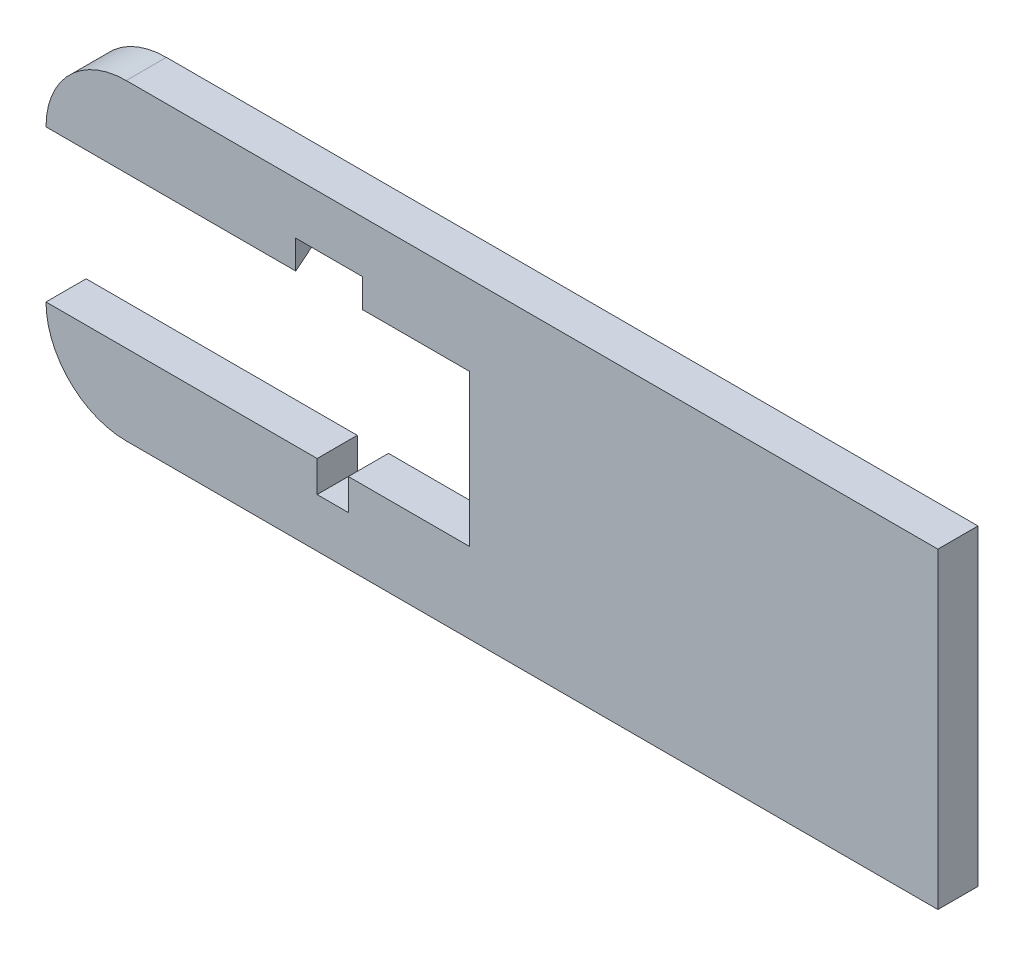
ISO-10303-21;
HEADER;
FILE_DESCRIPTION(('STEP AP214'),'2;1');
FILE_NAME('part.step','',(''),(''),'','','');
FILE_SCHEMA(('AUTOMOTIVE_DESIGN { 1 0 10303 214 1 1 1 1 }'));
ENDSEC;
DATA;
#1=APPLICATION_CONTEXT('core data for automotive mechanical design processes');
#2=APPLICATION_PROTOCOL_DEFINITION('international standard','automotive_design',2000,#1);
#3=PRODUCT_CONTEXT('',#1,'mechanical');
#4=PRODUCT('Part','Part','',(#3));
#5=PRODUCT_RELATED_PRODUCT_CATEGORY('part','',(#4));
#6=PRODUCT_DEFINITION_FORMATION('','',#4);
#7=PRODUCT_DEFINITION_CONTEXT('part definition',#1,'design');
#8=PRODUCT_DEFINITION('design','',#6,#7);
#9=PRODUCT_DEFINITION_SHAPE('','',#8);
#10=(LENGTH_UNIT() NAMED_UNIT(*) SI_UNIT(.MILLI.,.METRE.));
#11=(NAMED_UNIT(*) PLANE_ANGLE_UNIT() SI_UNIT($,.RADIAN.));
#12=(NAMED_UNIT(*) SI_UNIT($,.STERADIAN.) SOLID_ANGLE_UNIT());
#13=UNCERTAINTY_MEASURE_WITH_UNIT(LENGTH_MEASURE(1.E-05),#10,'distance_accuracy_value','');
#14=(GEOMETRIC_REPRESENTATION_CONTEXT(3) GLOBAL_UNCERTAINTY_ASSIGNED_CONTEXT((#13)) GLOBAL_UNIT_ASSIGNED_CONTEXT((#10,
#11,#12)) REPRESENTATION_CONTEXT('',''));
#15=CARTESIAN_POINT('',(0.,0.,0.));
#16=DIRECTION('',(0.,0.,1.));
#17=DIRECTION('',(1.,0.,0.));
#18=AXIS2_PLACEMENT_3D('',#15,#16,#17);
#19=CARTESIAN_POINT('',(120.65,66.04,0.));
#20=DIRECTION('',(0.,1.,0.));
#21=DIRECTION('',(0.,0.,1.));
#22=AXIS2_PLACEMENT_3D('',#19,#20,#21);
#23=PLANE('',#22);
#24=DIRECTION('',(-1.,0.,0.));
#25=VECTOR('',#24,1.);
#26=CARTESIAN_POINT('',(120.65,66.04,11.43));
#27=LINE('',#26,#25);
#28=CARTESIAN_POINT('',(120.65,66.04,11.43));
#29=VERTEX_POINT('',#28);
#30=CARTESIAN_POINT('',(90.17,66.04,11.43));
#31=VERTEX_POINT('',#30);
#32=EDGE_CURVE('E223',#29,#31,#27,.T.);
#33=ORIENTED_EDGE('',*,*,#32,.T.);
#34=DIRECTION('',(0.,0.,1.));
#35=VECTOR('',#34,1.);
#36=CARTESIAN_POINT('',(90.17,66.04,-20.7115157340065));
#37=LINE('',#36,#35);
#38=CARTESIAN_POINT('',(90.17,66.04,0.));
#39=VERTEX_POINT('',#38);
#40=EDGE_CURVE('E167',#39,#31,#37,.T.);
#41=ORIENTED_EDGE('',*,*,#40,.F.);
#42=DIRECTION('',(-1.,0.,0.));
#43=VECTOR('',#42,1.);
#44=CARTESIAN_POINT('',(120.65,66.04,0.));
#45=LINE('',#44,#43);
#46=CARTESIAN_POINT('',(120.65,66.04,0.));
#47=VERTEX_POINT('',#46);
#48=EDGE_CURVE('E218',#47,#39,#45,.T.);
#49=ORIENTED_EDGE('',*,*,#48,.F.);
#50=DIRECTION('',(0.,0.,-1.));
#51=VECTOR('',#50,1.);
#52=CARTESIAN_POINT('',(120.65,66.04,0.));
#53=LINE('',#52,#51);
#54=EDGE_CURVE('E56',#29,#47,#53,.T.);
#55=ORIENTED_EDGE('',*,*,#54,.F.);
#56=EDGE_LOOP('',(#33,#41,#49,#55));
#57=FACE_BOUND('',#56,.T.);
#58=ADVANCED_FACE('F33',(#57),#23,.F.);
#59=CARTESIAN_POINT('',(120.65,22.86,0.));
#60=DIRECTION('',(0.,-1.,0.));
#61=DIRECTION('',(0.,0.,-1.));
#62=AXIS2_PLACEMENT_3D('',#59,#60,#61);
#63=PLANE('',#62);
#64=DIRECTION('',(-1.,0.,0.));
#65=VECTOR('',#64,1.);
#66=CARTESIAN_POINT('',(120.65,22.86,0.));
#67=LINE('',#66,#65);
#68=CARTESIAN_POINT('',(120.65,22.86,0.));
#69=VERTEX_POINT('',#68);
#70=CARTESIAN_POINT('',(86.106,22.86,0.));
#71=VERTEX_POINT('',#70);
#72=EDGE_CURVE('E230',#69,#71,#67,.T.);
#73=ORIENTED_EDGE('',*,*,#72,.T.);
#74=DIRECTION('',(0.,0.,1.));
#75=VECTOR('',#74,1.);
#76=CARTESIAN_POINT('',(86.106,22.86,-12.5723585694968));
#77=LINE('',#76,#75);
#78=CARTESIAN_POINT('',(86.106,22.86,11.43));
#79=VERTEX_POINT('',#78);
#80=EDGE_CURVE('E203',#71,#79,#77,.T.);
#81=ORIENTED_EDGE('',*,*,#80,.T.);
#82=DIRECTION('',(-1.,0.,0.));
#83=VECTOR('',#82,1.);
#84=CARTESIAN_POINT('',(120.65,22.86,11.43));
#85=LINE('',#84,#83);
#86=CARTESIAN_POINT('',(120.65,22.86,11.43));
#87=VERTEX_POINT('',#86);
#88=EDGE_CURVE('E226',#87,#79,#85,.T.);
#89=ORIENTED_EDGE('',*,*,#88,.F.);
#90=DIRECTION('',(0.,0.,1.));
#91=VECTOR('',#90,1.);
#92=CARTESIAN_POINT('',(120.65,22.86,0.));
#93=LINE('',#92,#91);
#94=EDGE_CURVE('E211',#69,#87,#93,.T.);
#95=ORIENTED_EDGE('',*,*,#94,.F.);
#96=EDGE_LOOP('',(#73,#81,#89,#95));
#97=FACE_BOUND('',#96,.T.);
#98=ADVANCED_FACE('F310',(#97),#63,.F.);
#99=CARTESIAN_POINT('',(22.86,22.86,11.43));
#100=DIRECTION('',(0.,0.,-1.));
#101=DIRECTION('',(-1.,0.,0.));
#102=AXIS2_PLACEMENT_3D('',#99,#100,#101);
#103=CYLINDRICAL_SURFACE('',#102,22.86);
#104=DIRECTION('',(0.,0.,-1.));
#105=VECTOR('',#104,1.);
#106=CARTESIAN_POINT('',(22.86,0.,11.43));
#107=LINE('',#106,#105);
#108=CARTESIAN_POINT('',(22.86,0.,11.43));
#109=VERTEX_POINT('',#108);
#110=CARTESIAN_POINT('',(22.86,0.,0.));
#111=VERTEX_POINT('',#110);
#112=EDGE_CURVE('E262',#109,#111,#107,.T.);
#113=ORIENTED_EDGE('',*,*,#112,.F.);
#114=CARTESIAN_POINT('',(22.86,22.86,11.43));
#115=DIRECTION('',(0.,0.,-1.));
#116=DIRECTION('',(-1.,0.,0.));
#117=AXIS2_PLACEMENT_3D('',#114,#115,#116);
#118=CIRCLE('',#117,22.86);
#119=CARTESIAN_POINT('',(0.,22.86,11.43));
#120=VERTEX_POINT('',#119);
#121=EDGE_CURVE('E41',#120,#109,#118,.F.);
#122=ORIENTED_EDGE('',*,*,#121,.F.);
#123=DIRECTION('',(0.,0.,-1.));
#124=VECTOR('',#123,1.);
#125=CARTESIAN_POINT('',(0.,22.86,11.43));
#126=LINE('',#125,#124);
#127=CARTESIAN_POINT('',(0.,22.86,0.));
#128=VERTEX_POINT('',#127);
#129=EDGE_CURVE('E265',#128,#120,#126,.F.);
#130=ORIENTED_EDGE('',*,*,#129,.F.);
#131=CARTESIAN_POINT('',(22.86,22.86,0.));
#132=DIRECTION('',(0.,0.,-1.));
#133=DIRECTION('',(-1.,0.,0.));
#134=AXIS2_PLACEMENT_3D('',#131,#132,#133);
#135=CIRCLE('',#134,22.86);
#136=EDGE_CURVE('E11',#111,#128,#135,.T.);
#137=ORIENTED_EDGE('',*,*,#136,.F.);
#138=EDGE_LOOP('',(#113,#122,#130,#137));
#139=FACE_BOUND('',#138,.T.);
#140=ADVANCED_FACE('F35',(#139),#103,.T.);
#141=CARTESIAN_POINT('',(22.86,66.04,11.43));
#142=DIRECTION('',(0.,0.,-1.));
#143=DIRECTION('',(-1.,0.,0.));
#144=AXIS2_PLACEMENT_3D('',#141,#142,#143);
#145=CYLINDRICAL_SURFACE('',#144,22.86);
#146=DIRECTION('',(0.,0.,-1.));
#147=VECTOR('',#146,1.);
#148=CARTESIAN_POINT('',(0.,66.04,11.43));
#149=LINE('',#148,#147);
#150=CARTESIAN_POINT('',(0.,66.04,11.43));
#151=VERTEX_POINT('',#150);
#152=CARTESIAN_POINT('',(0.,66.04,0.));
#153=VERTEX_POINT('',#152);
#154=EDGE_CURVE('E252',#151,#153,#149,.T.);
#155=ORIENTED_EDGE('',*,*,#154,.F.);
#156=CARTESIAN_POINT('',(22.86,66.04,11.43));
#157=DIRECTION('',(0.,0.,-1.));
#158=DIRECTION('',(-1.,0.,0.));
#159=AXIS2_PLACEMENT_3D('',#156,#157,#158);
#160=CIRCLE('',#159,22.86);
#161=CARTESIAN_POINT('',(22.86,88.9,11.43));
#162=VERTEX_POINT('',#161);
#163=EDGE_CURVE('E258',#162,#151,#160,.F.);
#164=ORIENTED_EDGE('',*,*,#163,.F.);
#165=DIRECTION('',(0.,0.,-1.));
#166=VECTOR('',#165,1.);
#167=CARTESIAN_POINT('',(22.86,88.9,11.43));
#168=LINE('',#167,#166);
#169=CARTESIAN_POINT('',(22.86,88.9,0.));
#170=VERTEX_POINT('',#169);
#171=EDGE_CURVE('E255',#170,#162,#168,.F.);
#172=ORIENTED_EDGE('',*,*,#171,.F.);
#173=CARTESIAN_POINT('',(22.86,66.04,0.));
#174=DIRECTION('',(0.,0.,-1.));
#175=DIRECTION('',(-1.,0.,0.));
#176=AXIS2_PLACEMENT_3D('',#173,#174,#175);
#177=CIRCLE('',#176,22.86);
#178=EDGE_CURVE('E260',#153,#170,#177,.T.);
#179=ORIENTED_EDGE('',*,*,#178,.F.);
#180=EDGE_LOOP('',(#155,#164,#172,#179));
#181=FACE_BOUND('',#180,.T.);
#182=ADVANCED_FACE('F291',(#181),#145,.T.);
#183=CARTESIAN_POINT('',(0.,0.,11.43));
#184=DIRECTION('',(0.,1.,0.));
#185=DIRECTION('',(0.,0.,1.));
#186=AXIS2_PLACEMENT_3D('',#183,#184,#185);
#187=PLANE('',#186);
#188=DIRECTION('',(1.,0.,0.));
#189=VECTOR('',#188,1.);
#190=CARTESIAN_POINT('',(0.,0.,11.43));
#191=LINE('',#190,#189);
#192=CARTESIAN_POINT('',(254.,0.,11.43));
#193=VERTEX_POINT('',#192);
#194=EDGE_CURVE('E233',#109,#193,#191,.T.);
#195=ORIENTED_EDGE('',*,*,#194,.F.);
#196=ORIENTED_EDGE('',*,*,#112,.T.);
#197=DIRECTION('',(1.,0.,0.));
#198=VECTOR('',#197,1.);
#199=CARTESIAN_POINT('',(0.,0.,0.));
#200=LINE('',#199,#198);
#201=CARTESIAN_POINT('',(254.,0.,0.));
#202=VERTEX_POINT('',#201);
#203=EDGE_CURVE('E221',#111,#202,#200,.T.);
#204=ORIENTED_EDGE('',*,*,#203,.T.);
#205=DIRECTION('',(0.,0.,-1.));
#206=VECTOR('',#205,1.);
#207=CARTESIAN_POINT('',(254.,0.,11.43));
#208=LINE('',#207,#206);
#209=EDGE_CURVE('E249',#193,#202,#208,.T.);
#210=ORIENTED_EDGE('',*,*,#209,.F.);
#211=EDGE_LOOP('',(#195,#196,#204,#210));
#212=FACE_BOUND('',#211,.T.);
#213=ADVANCED_FACE('F277',(#212),#187,.F.);
#214=CARTESIAN_POINT('',(254.,0.,11.43));
#215=DIRECTION('',(-1.,0.,0.));
#216=DIRECTION('',(0.,0.,1.));
#217=AXIS2_PLACEMENT_3D('',#214,#215,#216);
#218=PLANE('',#217);
#219=DIRECTION('',(0.,1.,0.));
#220=VECTOR('',#219,1.);
#221=CARTESIAN_POINT('',(254.,0.,0.));
#222=LINE('',#221,#220);
#223=CARTESIAN_POINT('',(254.,88.9,0.));
#224=VERTEX_POINT('',#223);
#225=EDGE_CURVE('E243',#202,#224,#222,.T.);
#226=ORIENTED_EDGE('',*,*,#225,.T.);
#227=DIRECTION('',(0.,0.,-1.));
#228=VECTOR('',#227,1.);
#229=CARTESIAN_POINT('',(254.,88.9,11.43));
#230=LINE('',#229,#228);
#231=CARTESIAN_POINT('',(254.,88.9,11.43));
#232=VERTEX_POINT('',#231);
#233=EDGE_CURVE('E241',#232,#224,#230,.T.);
#234=ORIENTED_EDGE('',*,*,#233,.F.);
#235=DIRECTION('',(0.,1.,0.));
#236=VECTOR('',#235,1.);
#237=CARTESIAN_POINT('',(254.,0.,11.43));
#238=LINE('',#237,#236);
#239=EDGE_CURVE('E235',#193,#232,#238,.T.);
#240=ORIENTED_EDGE('',*,*,#239,.F.);
#241=ORIENTED_EDGE('',*,*,#209,.T.);
#242=EDGE_LOOP('',(#226,#234,#240,#241));
#243=FACE_BOUND('',#242,.T.);
#244=ADVANCED_FACE('F282',(#243),#218,.F.);
#245=CARTESIAN_POINT('',(0.,88.9,11.43));
#246=DIRECTION('',(0.,-1.,0.));
#247=DIRECTION('',(0.,0.,-1.));
#248=AXIS2_PLACEMENT_3D('',#245,#246,#247);
#249=PLANE('',#248);
#250=DIRECTION('',(-1.,0.,0.));
#251=VECTOR('',#250,1.);
#252=CARTESIAN_POINT('',(0.,88.9,0.));
#253=LINE('',#252,#251);
#254=EDGE_CURVE('E236',#224,#170,#253,.T.);
#255=ORIENTED_EDGE('',*,*,#254,.T.);
#256=ORIENTED_EDGE('',*,*,#171,.T.);
#257=DIRECTION('',(-1.,0.,0.));
#258=VECTOR('',#257,1.);
#259=CARTESIAN_POINT('',(0.,88.9,11.43));
#260=LINE('',#259,#258);
#261=EDGE_CURVE('E238',#232,#162,#260,.T.);
#262=ORIENTED_EDGE('',*,*,#261,.F.);
#263=ORIENTED_EDGE('',*,*,#233,.T.);
#264=EDGE_LOOP('',(#255,#256,#262,#263));
#265=FACE_BOUND('',#264,.T.);
#266=ADVANCED_FACE('F286',(#265),#249,.F.);
#267=CARTESIAN_POINT('',(0.,0.,11.43));
#268=DIRECTION('',(0.,0.,-1.));
#269=DIRECTION('',(-1.,0.,0.));
#270=AXIS2_PLACEMENT_3D('',#267,#268,#269);
#271=PLANE('',#270);
#272=DIRECTION('',(-1.,0.,0.));
#273=VECTOR('',#272,1.);
#274=CARTESIAN_POINT('',(71.12,74.168,11.43));
#275=LINE('',#274,#273);
#276=CARTESIAN_POINT('',(90.17,74.168,11.43));
#277=VERTEX_POINT('',#276);
#278=CARTESIAN_POINT('',(71.12,74.168,11.43));
#279=VERTEX_POINT('',#278);
#280=EDGE_CURVE('E160',#277,#279,#275,.T.);
#281=ORIENTED_EDGE('',*,*,#280,.F.);
#282=DIRECTION('',(0.,1.,0.));
#283=VECTOR('',#282,1.);
#284=CARTESIAN_POINT('',(90.17,66.04,11.43));
#285=LINE('',#284,#283);
#286=EDGE_CURVE('E168',#31,#277,#285,.T.);
#287=ORIENTED_EDGE('',*,*,#286,.F.);
#288=ORIENTED_EDGE('',*,*,#32,.F.);
#289=DIRECTION('',(0.,1.,0.));
#290=VECTOR('',#289,1.);
#291=CARTESIAN_POINT('',(120.65,22.86,11.43));
#292=LINE('',#291,#290);
#293=EDGE_CURVE('E214',#87,#29,#292,.T.);
#294=ORIENTED_EDGE('',*,*,#293,.F.);
#295=ORIENTED_EDGE('',*,*,#88,.T.);
#296=DIRECTION('',(0.,1.,0.));
#297=VECTOR('',#296,1.);
#298=CARTESIAN_POINT('',(86.106,22.86,11.43));
#299=LINE('',#298,#297);
#300=CARTESIAN_POINT('',(86.106,13.97,11.43));
#301=VERTEX_POINT('',#300);
#302=EDGE_CURVE('E186',#301,#79,#299,.T.);
#303=ORIENTED_EDGE('',*,*,#302,.F.);
#304=DIRECTION('',(1.,0.,0.));
#305=VECTOR('',#304,1.);
#306=CARTESIAN_POINT('',(77.216,13.97,11.43));
#307=LINE('',#306,#305);
#308=CARTESIAN_POINT('',(77.216,13.97,11.43));
#309=VERTEX_POINT('',#308);
#310=EDGE_CURVE('E189',#309,#301,#307,.T.);
#311=ORIENTED_EDGE('',*,*,#310,.F.);
#312=DIRECTION('',(0.,-1.,0.));
#313=VECTOR('',#312,1.);
#314=CARTESIAN_POINT('',(77.216,22.86,11.43));
#315=LINE('',#314,#313);
#316=CARTESIAN_POINT('',(77.216,22.86,11.43));
#317=VERTEX_POINT('',#316);
#318=EDGE_CURVE('E180',#317,#309,#315,.T.);
#319=ORIENTED_EDGE('',*,*,#318,.F.);
#320=EDGE_CURVE('E229',#317,#120,#85,.T.);
#321=ORIENTED_EDGE('',*,*,#320,.T.);
#322=ORIENTED_EDGE('',*,*,#121,.T.);
#323=ORIENTED_EDGE('',*,*,#194,.T.);
#324=ORIENTED_EDGE('',*,*,#239,.T.);
#325=ORIENTED_EDGE('',*,*,#261,.T.);
#326=ORIENTED_EDGE('',*,*,#163,.T.);
#327=CARTESIAN_POINT('',(71.12,66.04,11.43));
#328=VERTEX_POINT('',#327);
#329=EDGE_CURVE('E173',#328,#151,#27,.T.);
#330=ORIENTED_EDGE('',*,*,#329,.F.);
#331=DIRECTION('',(0.,-1.,0.));
#332=VECTOR('',#331,1.);
#333=CARTESIAN_POINT('',(71.12,66.04,11.43));
#334=LINE('',#333,#332);
#335=EDGE_CURVE('E152',#279,#328,#334,.T.);
#336=ORIENTED_EDGE('',*,*,#335,.F.);
#337=EDGE_LOOP('',(#281,#287,#288,#294,#295,#303,#311,#319,#321,#322,#323,#324,#325,#326,#330,#336));
#338=FACE_BOUND('',#337,.T.);
#339=ADVANCED_FACE('F171',(#338),#271,.F.);
#340=CARTESIAN_POINT('',(0.,0.,0.));
#341=DIRECTION('',(0.,0.,-1.));
#342=DIRECTION('',(-1.,0.,0.));
#343=AXIS2_PLACEMENT_3D('',#340,#341,#342);
#344=PLANE('',#343);
#345=DIRECTION('',(0.,-1.,0.));
#346=VECTOR('',#345,1.);
#347=CARTESIAN_POINT('',(66.04,74.168,0.));
#348=LINE('',#347,#346);
#349=CARTESIAN_POINT('',(66.04,74.168,0.));
#350=VERTEX_POINT('',#349);
#351=CARTESIAN_POINT('',(66.04,66.04,0.));
#352=VERTEX_POINT('',#351);
#353=EDGE_CURVE('E155',#350,#352,#348,.T.);
#354=ORIENTED_EDGE('',*,*,#353,.T.);
#355=EDGE_CURVE('E222',#352,#153,#45,.T.);
#356=ORIENTED_EDGE('',*,*,#355,.T.);
#357=ORIENTED_EDGE('',*,*,#178,.T.);
#358=ORIENTED_EDGE('',*,*,#254,.F.);
#359=ORIENTED_EDGE('',*,*,#225,.F.);
#360=ORIENTED_EDGE('',*,*,#203,.F.);
#361=ORIENTED_EDGE('',*,*,#136,.T.);
#362=CARTESIAN_POINT('',(77.216,22.86,0.));
#363=VERTEX_POINT('',#362);
#364=EDGE_CURVE('E217',#363,#128,#67,.T.);
#365=ORIENTED_EDGE('',*,*,#364,.F.);
#366=DIRECTION('',(0.,-1.,0.));
#367=VECTOR('',#366,1.);
#368=CARTESIAN_POINT('',(77.216,22.86,0.));
#369=LINE('',#368,#367);
#370=CARTESIAN_POINT('',(77.216,13.97,0.));
#371=VERTEX_POINT('',#370);
#372=EDGE_CURVE('E48',#363,#371,#369,.T.);
#373=ORIENTED_EDGE('',*,*,#372,.T.);
#374=DIRECTION('',(1.,0.,0.));
#375=VECTOR('',#374,1.);
#376=CARTESIAN_POINT('',(77.216,13.97,0.));
#377=LINE('',#376,#375);
#378=CARTESIAN_POINT('',(86.106,13.97,0.));
#379=VERTEX_POINT('',#378);
#380=EDGE_CURVE('E188',#371,#379,#377,.T.);
#381=ORIENTED_EDGE('',*,*,#380,.T.);
#382=DIRECTION('',(0.,1.,0.));
#383=VECTOR('',#382,1.);
#384=CARTESIAN_POINT('',(86.106,22.86,0.));
#385=LINE('',#384,#383);
#386=EDGE_CURVE('E200',#379,#71,#385,.T.);
#387=ORIENTED_EDGE('',*,*,#386,.T.);
#388=ORIENTED_EDGE('',*,*,#72,.F.);
#389=DIRECTION('',(0.,-1.,0.));
#390=VECTOR('',#389,1.);
#391=CARTESIAN_POINT('',(120.65,22.86,0.));
#392=LINE('',#391,#390);
#393=EDGE_CURVE('E209',#47,#69,#392,.T.);
#394=ORIENTED_EDGE('',*,*,#393,.F.);
#395=ORIENTED_EDGE('',*,*,#48,.T.);
#396=DIRECTION('',(0.,1.,0.));
#397=VECTOR('',#396,1.);
#398=CARTESIAN_POINT('',(90.17,66.04,0.));
#399=LINE('',#398,#397);
#400=CARTESIAN_POINT('',(90.17,74.168,0.));
#401=VERTEX_POINT('',#400);
#402=EDGE_CURVE('E181',#39,#401,#399,.T.);
#403=ORIENTED_EDGE('',*,*,#402,.T.);
#404=DIRECTION('',(-1.,0.,0.));
#405=VECTOR('',#404,1.);
#406=CARTESIAN_POINT('',(71.12,74.168,0.));
#407=LINE('',#406,#405);
#408=EDGE_CURVE('E178',#401,#350,#407,.T.);
#409=ORIENTED_EDGE('',*,*,#408,.T.);
#410=EDGE_LOOP('',(#354,#356,#357,#358,#359,#360,#361,#365,#373,#381,#387,#388,#394,#395,#403,#409));
#411=FACE_BOUND('',#410,.T.);
#412=ADVANCED_FACE('F297',(#411),#344,.T.);
#413=ORIENTED_EDGE('',*,*,#355,.F.);
#414=DIRECTION('',(-0.406138466053449,0.,-0.913811548620257));
#415=VECTOR('',#414,1.);
#416=CARTESIAN_POINT('',(66.04,66.04,0.));
#417=LINE('',#416,#415);
#418=EDGE_CURVE('E157',#328,#352,#417,.T.);
#419=ORIENTED_EDGE('',*,*,#418,.F.);
#420=ORIENTED_EDGE('',*,*,#329,.T.);
#421=ORIENTED_EDGE('',*,*,#154,.T.);
#422=EDGE_LOOP('',(#413,#419,#420,#421));
#423=FACE_BOUND('',#422,.T.);
#424=ADVANCED_FACE('F294',(#423),#23,.F.);
#425=ORIENTED_EDGE('',*,*,#320,.F.);
#426=DIRECTION('',(0.,0.,1.));
#427=VECTOR('',#426,1.);
#428=CARTESIAN_POINT('',(77.216,22.86,-12.5723585694968));
#429=LINE('',#428,#427);
#430=EDGE_CURVE('E199',#363,#317,#429,.T.);
#431=ORIENTED_EDGE('',*,*,#430,.F.);
#432=ORIENTED_EDGE('',*,*,#364,.T.);
#433=ORIENTED_EDGE('',*,*,#129,.T.);
#434=EDGE_LOOP('',(#425,#431,#432,#433));
#435=FACE_BOUND('',#434,.T.);
#436=ADVANCED_FACE('F319',(#435),#63,.F.);
#437=CARTESIAN_POINT('',(120.65,0.,0.));
#438=DIRECTION('',(1.,0.,0.));
#439=DIRECTION('',(0.,0.,-1.));
#440=AXIS2_PLACEMENT_3D('',#437,#438,#439);
#441=PLANE('',#440);
#442=ORIENTED_EDGE('',*,*,#393,.T.);
#443=ORIENTED_EDGE('',*,*,#94,.T.);
#444=ORIENTED_EDGE('',*,*,#293,.T.);
#445=ORIENTED_EDGE('',*,*,#54,.T.);
#446=EDGE_LOOP('',(#442,#443,#444,#445));
#447=FACE_BOUND('',#446,.T.);
#448=ADVANCED_FACE('F306',(#447),#441,.F.);
#449=CARTESIAN_POINT('',(77.216,13.97,-12.5723585694968));
#450=DIRECTION('',(0.,-1.,0.));
#451=DIRECTION('',(0.,0.,-1.));
#452=AXIS2_PLACEMENT_3D('',#449,#450,#451);
#453=PLANE('',#452);
#454=DIRECTION('',(0.,0.,1.));
#455=VECTOR('',#454,1.);
#456=CARTESIAN_POINT('',(77.216,13.97,-12.5723585694968));
#457=LINE('',#456,#455);
#458=EDGE_CURVE('E198',#371,#309,#457,.T.);
#459=ORIENTED_EDGE('',*,*,#458,.T.);
#460=ORIENTED_EDGE('',*,*,#310,.T.);
#461=DIRECTION('',(0.,0.,1.));
#462=VECTOR('',#461,1.);
#463=CARTESIAN_POINT('',(86.106,13.97,-12.5723585694968));
#464=LINE('',#463,#462);
#465=EDGE_CURVE('E196',#379,#301,#464,.T.);
#466=ORIENTED_EDGE('',*,*,#465,.F.);
#467=ORIENTED_EDGE('',*,*,#380,.F.);
#468=EDGE_LOOP('',(#459,#460,#466,#467));
#469=FACE_BOUND('',#468,.T.);
#470=ADVANCED_FACE('F316',(#469),#453,.F.);
#471=CARTESIAN_POINT('',(86.106,22.86,-12.5723585694968));
#472=DIRECTION('',(1.,0.,0.));
#473=DIRECTION('',(0.,0.,-1.));
#474=AXIS2_PLACEMENT_3D('',#471,#472,#473);
#475=PLANE('',#474);
#476=ORIENTED_EDGE('',*,*,#465,.T.);
#477=ORIENTED_EDGE('',*,*,#302,.T.);
#478=ORIENTED_EDGE('',*,*,#80,.F.);
#479=ORIENTED_EDGE('',*,*,#386,.F.);
#480=EDGE_LOOP('',(#476,#477,#478,#479));
#481=FACE_BOUND('',#480,.T.);
#482=ADVANCED_FACE('F312',(#481),#475,.F.);
#483=CARTESIAN_POINT('',(77.216,22.86,-12.5723585694968));
#484=DIRECTION('',(-1.,0.,0.));
#485=DIRECTION('',(0.,0.,1.));
#486=AXIS2_PLACEMENT_3D('',#483,#484,#485);
#487=PLANE('',#486);
#488=ORIENTED_EDGE('',*,*,#430,.T.);
#489=ORIENTED_EDGE('',*,*,#318,.T.);
#490=ORIENTED_EDGE('',*,*,#458,.F.);
#491=ORIENTED_EDGE('',*,*,#372,.F.);
#492=EDGE_LOOP('',(#488,#489,#490,#491));
#493=FACE_BOUND('',#492,.T.);
#494=ADVANCED_FACE('F317',(#493),#487,.F.);
#495=CARTESIAN_POINT('',(90.17,66.04,-20.7115157340065));
#496=DIRECTION('',(1.,0.,0.));
#497=DIRECTION('',(0.,0.,-1.));
#498=AXIS2_PLACEMENT_3D('',#495,#496,#497);
#499=PLANE('',#498);
#500=ORIENTED_EDGE('',*,*,#40,.T.);
#501=ORIENTED_EDGE('',*,*,#286,.T.);
#502=DIRECTION('',(0.,0.,1.));
#503=VECTOR('',#502,1.);
#504=CARTESIAN_POINT('',(90.17,74.168,-20.7115157340065));
#505=LINE('',#504,#503);
#506=EDGE_CURVE('E163',#401,#277,#505,.T.);
#507=ORIENTED_EDGE('',*,*,#506,.F.);
#508=ORIENTED_EDGE('',*,*,#402,.F.);
#509=EDGE_LOOP('',(#500,#501,#507,#508));
#510=FACE_BOUND('',#509,.T.);
#511=ADVANCED_FACE('F299',(#510),#499,.F.);
#512=CARTESIAN_POINT('',(71.12,74.168,-20.7115157340065));
#513=DIRECTION('',(0.,1.,0.));
#514=DIRECTION('',(0.,0.,1.));
#515=AXIS2_PLACEMENT_3D('',#512,#513,#514);
#516=PLANE('',#515);
#517=ORIENTED_EDGE('',*,*,#506,.T.);
#518=ORIENTED_EDGE('',*,*,#280,.T.);
#519=DIRECTION('',(-0.406138466053449,0.,-0.913811548620257));
#520=VECTOR('',#519,1.);
#521=CARTESIAN_POINT('',(66.04,74.168,0.));
#522=LINE('',#521,#520);
#523=EDGE_CURVE('E148',#279,#350,#522,.T.);
#524=ORIENTED_EDGE('',*,*,#523,.T.);
#525=ORIENTED_EDGE('',*,*,#408,.F.);
#526=EDGE_LOOP('',(#517,#518,#524,#525));
#527=FACE_BOUND('',#526,.T.);
#528=ADVANCED_FACE('F161',(#527),#516,.F.);
#529=CARTESIAN_POINT('',(66.04,74.168,0.));
#530=DIRECTION('',(-0.913811548620257,0.,0.406138466053449));
#531=DIRECTION('',(0.406138466053449,0.,0.913811548620257));
#532=AXIS2_PLACEMENT_3D('',#529,#530,#531);
#533=PLANE('',#532);
#534=ORIENTED_EDGE('',*,*,#418,.T.);
#535=ORIENTED_EDGE('',*,*,#353,.F.);
#536=ORIENTED_EDGE('',*,*,#523,.F.);
#537=ORIENTED_EDGE('',*,*,#335,.T.);
#538=EDGE_LOOP('',(#534,#535,#536,#537));
#539=FACE_BOUND('',#538,.T.);
#540=ADVANCED_FACE('F150',(#539),#533,.F.);
#541=CLOSED_SHELL('',(#58,#98,#140,#182,#213,#244,#266,#339,#412,#424,#436,#448,#470,#482,#494,
#511,#528,#540));
#542=MANIFOLD_SOLID_BREP('B2',#541);
#543=ADVANCED_BREP_SHAPE_REPRESENTATION('',(#18,#542),#14);
#544=SHAPE_DEFINITION_REPRESENTATION(#9,#543);
ENDSEC;
END-ISO-10303-21;
